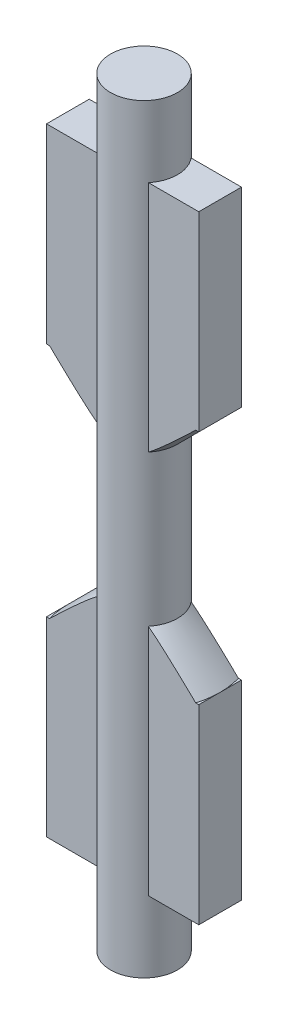
ISO-10303-21;
HEADER;
FILE_DESCRIPTION(('STEP AP214'),'2;1');
FILE_NAME('part.step','',(''),(''),'','','');
FILE_SCHEMA(('AUTOMOTIVE_DESIGN { 1 0 10303 214 1 1 1 1 }'));
ENDSEC;
DATA;
#1=APPLICATION_CONTEXT('core data for automotive mechanical design processes');
#2=APPLICATION_PROTOCOL_DEFINITION('international standard','automotive_design',2000,#1);
#3=PRODUCT_CONTEXT('',#1,'mechanical');
#4=PRODUCT('Part','Part','',(#3));
#5=PRODUCT_RELATED_PRODUCT_CATEGORY('part','',(#4));
#6=PRODUCT_DEFINITION_FORMATION('','',#4);
#7=PRODUCT_DEFINITION_CONTEXT('part definition',#1,'design');
#8=PRODUCT_DEFINITION('design','',#6,#7);
#9=PRODUCT_DEFINITION_SHAPE('','',#8);
#10=(LENGTH_UNIT() NAMED_UNIT(*) SI_UNIT(.MILLI.,.METRE.));
#11=(NAMED_UNIT(*) PLANE_ANGLE_UNIT() SI_UNIT($,.RADIAN.));
#12=(NAMED_UNIT(*) SI_UNIT($,.STERADIAN.) SOLID_ANGLE_UNIT());
#13=UNCERTAINTY_MEASURE_WITH_UNIT(LENGTH_MEASURE(1.E-05),#10,'distance_accuracy_value','');
#14=(GEOMETRIC_REPRESENTATION_CONTEXT(3) GLOBAL_UNCERTAINTY_ASSIGNED_CONTEXT((#13)) GLOBAL_UNIT_ASSIGNED_CONTEXT((#10,
#11,#12)) REPRESENTATION_CONTEXT('',''));
#15=CARTESIAN_POINT('',(0.,0.,0.));
#16=DIRECTION('',(0.,0.,1.));
#17=DIRECTION('',(1.,0.,0.));
#18=AXIS2_PLACEMENT_3D('',#15,#16,#17);
#19=CARTESIAN_POINT('',(0.,18.4,0.));
#20=DIRECTION('',(0.,1.,0.));
#21=DIRECTION('',(0.,0.,1.));
#22=AXIS2_PLACEMENT_3D('',#19,#20,#21);
#23=PLANE('',#22);
#24=DIRECTION('',(1.,0.,0.));
#25=VECTOR('',#24,1.);
#26=CARTESIAN_POINT('',(-1.80900525151255,18.4,1.5));
#27=LINE('',#26,#25);
#28=CARTESIAN_POINT('',(-5.35,18.4,1.5));
#29=VERTEX_POINT('',#28);
#30=CARTESIAN_POINT('',(-5.13541624408382,18.4,1.5));
#31=VERTEX_POINT('',#30);
#32=EDGE_CURVE('E439',#29,#31,#27,.T.);
#33=ORIENTED_EDGE('',*,*,#32,.T.);
#34=CARTESIAN_POINT('',(0.,18.4,0.));
#35=DIRECTION('',(0.,1.,0.));
#36=DIRECTION('',(0.,0.,1.));
#37=AXIS2_PLACEMENT_3D('',#34,#35,#36);
#38=CIRCLE('',#37,5.34999999999999);
#39=CARTESIAN_POINT('',(-5.35,18.4,0.));
#40=VERTEX_POINT('',#39);
#41=EDGE_CURVE('E76',#31,#40,#38,.F.);
#42=ORIENTED_EDGE('',*,*,#41,.T.);
#43=DIRECTION('',(0.,0.,1.));
#44=VECTOR('',#43,1.);
#45=CARTESIAN_POINT('',(-5.35,18.4,1.5));
#46=LINE('',#45,#44);
#47=EDGE_CURVE('E440',#40,#29,#46,.T.);
#48=ORIENTED_EDGE('',*,*,#47,.T.);
#49=EDGE_LOOP('',(#33,#42,#48));
#50=FACE_BOUND('',#49,.T.);
#51=ADVANCED_FACE('F47',(#50),#23,.T.);
#52=DIRECTION('',(-1.,0.,0.));
#53=VECTOR('',#52,1.);
#54=CARTESIAN_POINT('',(5.35,18.4,-1.5));
#55=LINE('',#54,#53);
#56=CARTESIAN_POINT('',(5.35,18.4,-1.5));
#57=VERTEX_POINT('',#56);
#58=CARTESIAN_POINT('',(5.13541624408382,18.4,-1.5));
#59=VERTEX_POINT('',#58);
#60=EDGE_CURVE('E452',#57,#59,#55,.T.);
#61=ORIENTED_EDGE('',*,*,#60,.T.);
#62=CARTESIAN_POINT('',(0.,18.4,0.));
#63=DIRECTION('',(0.,1.,0.));
#64=DIRECTION('',(0.,0.,1.));
#65=AXIS2_PLACEMENT_3D('',#62,#63,#64);
#66=CIRCLE('',#65,5.34999999999999);
#67=CARTESIAN_POINT('',(5.35,18.4,0.));
#68=VERTEX_POINT('',#67);
#69=EDGE_CURVE('E295',#59,#68,#66,.F.);
#70=ORIENTED_EDGE('',*,*,#69,.T.);
#71=DIRECTION('',(0.,0.,-1.));
#72=VECTOR('',#71,1.);
#73=CARTESIAN_POINT('',(5.35,18.4,1.5));
#74=LINE('',#73,#72);
#75=EDGE_CURVE('E524',#68,#57,#74,.T.);
#76=ORIENTED_EDGE('',*,*,#75,.T.);
#77=EDGE_LOOP('',(#61,#70,#76));
#78=FACE_BOUND('',#77,.T.);
#79=ADVANCED_FACE('F408',(#78),#23,.T.);
#80=CARTESIAN_POINT('',(0.,35.,0.));
#81=DIRECTION('',(0.,1.,0.));
#82=DIRECTION('',(0.,0.,1.));
#83=AXIS2_PLACEMENT_3D('',#80,#81,#82);
#84=PLANE('',#83);
#85=DIRECTION('',(-1.,0.,0.));
#86=VECTOR('',#85,1.);
#87=CARTESIAN_POINT('',(0.,35.,1.5));
#88=LINE('',#87,#86);
#89=CARTESIAN_POINT('',(5.35,35.,1.5));
#90=VERTEX_POINT('',#89);
#91=CARTESIAN_POINT('',(5.13541624408385,35.,1.5));
#92=VERTEX_POINT('',#91);
#93=EDGE_CURVE('E557',#90,#92,#88,.T.);
#94=ORIENTED_EDGE('',*,*,#93,.T.);
#95=CARTESIAN_POINT('',(0.,35.,0.));
#96=DIRECTION('',(0.,1.,0.));
#97=DIRECTION('',(0.,0.,1.));
#98=AXIS2_PLACEMENT_3D('',#95,#96,#97);
#99=CIRCLE('',#98,5.35000000000002);
#100=CARTESIAN_POINT('',(5.35,35.,0.));
#101=VERTEX_POINT('',#100);
#102=EDGE_CURVE('E288',#92,#101,#99,.T.);
#103=ORIENTED_EDGE('',*,*,#102,.T.);
#104=DIRECTION('',(0.,0.,1.));
#105=VECTOR('',#104,1.);
#106=CARTESIAN_POINT('',(5.35,35.,0.));
#107=LINE('',#106,#105);
#108=EDGE_CURVE('E565',#101,#90,#107,.T.);
#109=ORIENTED_EDGE('',*,*,#108,.T.);
#110=EDGE_LOOP('',(#94,#103,#109));
#111=FACE_BOUND('',#110,.T.);
#112=ADVANCED_FACE('F415',(#111),#84,.F.);
#113=DIRECTION('',(1.,0.,0.));
#114=VECTOR('',#113,1.);
#115=CARTESIAN_POINT('',(0.,35.,-1.5));
#116=LINE('',#115,#114);
#117=CARTESIAN_POINT('',(-5.35,35.,-1.5));
#118=VERTEX_POINT('',#117);
#119=CARTESIAN_POINT('',(-5.13541624408385,35.,-1.5));
#120=VERTEX_POINT('',#119);
#121=EDGE_CURVE('E569',#118,#120,#116,.T.);
#122=ORIENTED_EDGE('',*,*,#121,.T.);
#123=CARTESIAN_POINT('',(0.,35.,0.));
#124=DIRECTION('',(0.,1.,0.));
#125=DIRECTION('',(0.,0.,1.));
#126=AXIS2_PLACEMENT_3D('',#123,#124,#125);
#127=CIRCLE('',#126,5.35000000000002);
#128=CARTESIAN_POINT('',(-5.35,35.,0.));
#129=VERTEX_POINT('',#128);
#130=EDGE_CURVE('E251',#120,#129,#127,.T.);
#131=ORIENTED_EDGE('',*,*,#130,.T.);
#132=DIRECTION('',(0.,0.,-1.));
#133=VECTOR('',#132,1.);
#134=CARTESIAN_POINT('',(-5.35,35.,0.));
#135=LINE('',#134,#133);
#136=EDGE_CURVE('E240',#129,#118,#135,.T.);
#137=ORIENTED_EDGE('',*,*,#136,.T.);
#138=EDGE_LOOP('',(#122,#131,#137));
#139=FACE_BOUND('',#138,.T.);
#140=ADVANCED_FACE('F633',(#139),#84,.F.);
#141=CARTESIAN_POINT('',(0.,48.4,0.));
#142=DIRECTION('',(0.,1.,0.));
#143=DIRECTION('',(0.,0.,1.));
#144=AXIS2_PLACEMENT_3D('',#141,#142,#143);
#145=PLANE('',#144);
#146=CARTESIAN_POINT('',(0.,48.4,0.));
#147=DIRECTION('',(0.,1.,0.));
#148=DIRECTION('',(0.,0.,1.));
#149=AXIS2_PLACEMENT_3D('',#146,#147,#148);
#150=CIRCLE('',#149,2.35);
#151=CARTESIAN_POINT('',(1.80900525151255,48.4,1.5));
#152=VERTEX_POINT('',#151);
#153=CARTESIAN_POINT('',(1.80900525151255,48.4,-1.5));
#154=VERTEX_POINT('',#153);
#155=EDGE_CURVE('E223',#152,#154,#150,.T.);
#156=ORIENTED_EDGE('',*,*,#155,.F.);
#157=DIRECTION('',(-1.,0.,0.));
#158=VECTOR('',#157,1.);
#159=CARTESIAN_POINT('',(0.,48.4,1.5));
#160=LINE('',#159,#158);
#161=CARTESIAN_POINT('',(5.35,48.4,1.5));
#162=VERTEX_POINT('',#161);
#163=EDGE_CURVE('E203',#162,#152,#160,.T.);
#164=ORIENTED_EDGE('',*,*,#163,.F.);
#165=DIRECTION('',(0.,0.,1.));
#166=VECTOR('',#165,1.);
#167=CARTESIAN_POINT('',(5.35,48.4,0.));
#168=LINE('',#167,#166);
#169=CARTESIAN_POINT('',(5.35,48.4,-1.5));
#170=VERTEX_POINT('',#169);
#171=EDGE_CURVE('E217',#170,#162,#168,.T.);
#172=ORIENTED_EDGE('',*,*,#171,.F.);
#173=DIRECTION('',(1.,0.,0.));
#174=VECTOR('',#173,1.);
#175=CARTESIAN_POINT('',(0.,48.4,-1.5));
#176=LINE('',#175,#174);
#177=EDGE_CURVE('E233',#154,#170,#176,.T.);
#178=ORIENTED_EDGE('',*,*,#177,.F.);
#179=EDGE_LOOP('',(#156,#164,#172,#178));
#180=FACE_BOUND('',#179,.T.);
#181=ADVANCED_FACE('F231',(#180),#145,.T.);
#182=CARTESIAN_POINT('',(5.35,18.4,1.5));
#183=VERTEX_POINT('',#182);
#184=EDGE_CURVE('E457',#183,#68,#74,.T.);
#185=ORIENTED_EDGE('',*,*,#184,.T.);
#186=CARTESIAN_POINT('',(0.,18.4,0.));
#187=DIRECTION('',(0.,1.,0.));
#188=DIRECTION('',(0.,0.,1.));
#189=AXIS2_PLACEMENT_3D('',#186,#187,#188);
#190=CIRCLE('',#189,5.34999999999999);
#191=CARTESIAN_POINT('',(5.13541624408382,18.4,1.5));
#192=VERTEX_POINT('',#191);
#193=EDGE_CURVE('E292',#68,#192,#190,.F.);
#194=ORIENTED_EDGE('',*,*,#193,.T.);
#195=DIRECTION('',(1.,0.,0.));
#196=VECTOR('',#195,1.);
#197=CARTESIAN_POINT('',(1.80900525151255,18.4,1.5));
#198=LINE('',#197,#196);
#199=EDGE_CURVE('E484',#192,#183,#198,.T.);
#200=ORIENTED_EDGE('',*,*,#199,.T.);
#201=EDGE_LOOP('',(#185,#194,#200));
#202=FACE_BOUND('',#201,.T.);
#203=ADVANCED_FACE('F401',(#202),#23,.T.);
#204=CARTESIAN_POINT('',(0.,5.,0.));
#205=DIRECTION('',(0.,-1.,0.));
#206=DIRECTION('',(0.,0.,-1.));
#207=AXIS2_PLACEMENT_3D('',#204,#205,#206);
#208=CYLINDRICAL_SURFACE('',#207,2.35);
#209=DIRECTION('',(0.,-1.,0.));
#210=VECTOR('',#209,1.);
#211=CARTESIAN_POINT('',(-1.80900525151255,48.4,1.5));
#212=LINE('',#211,#210);
#213=CARTESIAN_POINT('',(-1.80900525151255,48.4,1.5));
#214=VERTEX_POINT('',#213);
#215=CARTESIAN_POINT('',(-1.80900525151255,32.,1.5));
#216=VERTEX_POINT('',#215);
#217=EDGE_CURVE('E228',#214,#216,#212,.T.);
#218=ORIENTED_EDGE('',*,*,#217,.T.);
#219=CARTESIAN_POINT('',(0.,32.,0.));
#220=DIRECTION('',(0.,1.,0.));
#221=DIRECTION('',(0.,0.,1.));
#222=AXIS2_PLACEMENT_3D('',#219,#220,#221);
#223=CIRCLE('',#222,2.35);
#224=CARTESIAN_POINT('',(-1.80900525151255,32.,-1.5));
#225=VERTEX_POINT('',#224);
#226=EDGE_CURVE('E281',#216,#225,#223,.F.);
#227=ORIENTED_EDGE('',*,*,#226,.T.);
#228=DIRECTION('',(0.,-1.,0.));
#229=VECTOR('',#228,1.);
#230=CARTESIAN_POINT('',(-1.80900525151255,48.4,-1.5));
#231=LINE('',#230,#229);
#232=CARTESIAN_POINT('',(-1.80900525151255,48.4,-1.5));
#233=VERTEX_POINT('',#232);
#234=EDGE_CURVE('E536',#233,#225,#231,.T.);
#235=ORIENTED_EDGE('',*,*,#234,.F.);
#236=EDGE_CURVE('E237',#233,#214,#150,.T.);
#237=ORIENTED_EDGE('',*,*,#236,.T.);
#238=EDGE_LOOP('',(#218,#227,#235,#237));
#239=FACE_BOUND('',#238,.T.);
#240=CARTESIAN_POINT('',(0.,21.4,0.));
#241=DIRECTION('',(0.,1.,0.));
#242=DIRECTION('',(0.,0.,1.));
#243=AXIS2_PLACEMENT_3D('',#240,#241,#242);
#244=CIRCLE('',#243,2.35);
#245=CARTESIAN_POINT('',(-1.80900525151255,21.4,-1.5));
#246=VERTEX_POINT('',#245);
#247=CARTESIAN_POINT('',(-1.80900525151255,21.4,1.5));
#248=VERTEX_POINT('',#247);
#249=EDGE_CURVE('E271',#246,#248,#244,.T.);
#250=ORIENTED_EDGE('',*,*,#249,.T.);
#251=DIRECTION('',(0.,-1.,0.));
#252=VECTOR('',#251,1.);
#253=CARTESIAN_POINT('',(-1.80900525151255,18.4,1.5));
#254=LINE('',#253,#252);
#255=CARTESIAN_POINT('',(-1.80900525151255,5.,1.5));
#256=VERTEX_POINT('',#255);
#257=EDGE_CURVE('E463',#248,#256,#254,.T.);
#258=ORIENTED_EDGE('',*,*,#257,.T.);
#259=CARTESIAN_POINT('',(0.,5.,0.));
#260=DIRECTION('',(0.,1.,0.));
#261=DIRECTION('',(0.,0.,1.));
#262=AXIS2_PLACEMENT_3D('',#259,#260,#261);
#263=CIRCLE('',#262,2.35);
#264=CARTESIAN_POINT('',(-1.80900525151255,5.,-1.5));
#265=VERTEX_POINT('',#264);
#266=EDGE_CURVE('E253',#265,#256,#263,.T.);
#267=ORIENTED_EDGE('',*,*,#266,.F.);
#268=DIRECTION('',(0.,-1.,0.));
#269=VECTOR('',#268,1.);
#270=CARTESIAN_POINT('',(-1.80900525151255,18.4,-1.5));
#271=LINE('',#270,#269);
#272=EDGE_CURVE('E448',#246,#265,#271,.T.);
#273=ORIENTED_EDGE('',*,*,#272,.F.);
#274=EDGE_LOOP('',(#250,#258,#267,#273));
#275=FACE_BOUND('',#274,.T.);
#276=CARTESIAN_POINT('',(0.,21.4,0.));
#277=DIRECTION('',(0.,1.,0.));
#278=DIRECTION('',(0.,0.,1.));
#279=AXIS2_PLACEMENT_3D('',#276,#277,#278);
#280=CIRCLE('',#279,2.35);
#281=CARTESIAN_POINT('',(1.80900525151255,21.4,1.5));
#282=VERTEX_POINT('',#281);
#283=CARTESIAN_POINT('',(1.80900525151255,21.4,-1.5));
#284=VERTEX_POINT('',#283);
#285=EDGE_CURVE('E275',#282,#284,#280,.T.);
#286=ORIENTED_EDGE('',*,*,#285,.T.);
#287=DIRECTION('',(0.,-1.,0.));
#288=VECTOR('',#287,1.);
#289=CARTESIAN_POINT('',(1.80900525151255,18.4,-1.5));
#290=LINE('',#289,#288);
#291=CARTESIAN_POINT('',(1.80900525151255,5.,-1.5));
#292=VERTEX_POINT('',#291);
#293=EDGE_CURVE('E496',#284,#292,#290,.T.);
#294=ORIENTED_EDGE('',*,*,#293,.T.);
#295=CARTESIAN_POINT('',(1.80900525151255,5.,1.5));
#296=VERTEX_POINT('',#295);
#297=EDGE_CURVE('E246',#296,#292,#263,.T.);
#298=ORIENTED_EDGE('',*,*,#297,.F.);
#299=DIRECTION('',(0.,-1.,0.));
#300=VECTOR('',#299,1.);
#301=CARTESIAN_POINT('',(1.80900525151255,18.4,1.5));
#302=LINE('',#301,#300);
#303=EDGE_CURVE('E263',#282,#296,#302,.T.);
#304=ORIENTED_EDGE('',*,*,#303,.F.);
#305=EDGE_LOOP('',(#286,#294,#298,#304));
#306=FACE_BOUND('',#305,.T.);
#307=CARTESIAN_POINT('',(0.,0.,0.));
#308=DIRECTION('',(0.,1.,0.));
#309=DIRECTION('',(0.,0.,1.));
#310=AXIS2_PLACEMENT_3D('',#307,#308,#309);
#311=CIRCLE('',#310,2.35);
#312=CARTESIAN_POINT('',(0.,0.,2.35));
#313=VERTEX_POINT('',#312);
#314=EDGE_CURVE('E260',#313,#313,#311,.T.);
#315=ORIENTED_EDGE('',*,*,#314,.T.);
#316=EDGE_LOOP('',(#315));
#317=FACE_BOUND('',#316,.T.);
#318=DIRECTION('',(0.,-1.,0.));
#319=VECTOR('',#318,1.);
#320=CARTESIAN_POINT('',(1.80900525151255,48.4,-1.5));
#321=LINE('',#320,#319);
#322=CARTESIAN_POINT('',(1.80900525151255,32.,-1.5));
#323=VERTEX_POINT('',#322);
#324=EDGE_CURVE('E539',#154,#323,#321,.T.);
#325=ORIENTED_EDGE('',*,*,#324,.T.);
#326=CARTESIAN_POINT('',(0.,32.,0.));
#327=DIRECTION('',(0.,1.,0.));
#328=DIRECTION('',(0.,0.,1.));
#329=AXIS2_PLACEMENT_3D('',#326,#327,#328);
#330=CIRCLE('',#329,2.35);
#331=CARTESIAN_POINT('',(1.80900525151255,32.,1.5));
#332=VERTEX_POINT('',#331);
#333=EDGE_CURVE('E225',#323,#332,#330,.F.);
#334=ORIENTED_EDGE('',*,*,#333,.T.);
#335=DIRECTION('',(0.,-1.,0.));
#336=VECTOR('',#335,1.);
#337=CARTESIAN_POINT('',(1.80900525151255,48.4,1.5));
#338=LINE('',#337,#336);
#339=EDGE_CURVE('E207',#152,#332,#338,.T.);
#340=ORIENTED_EDGE('',*,*,#339,.F.);
#341=ORIENTED_EDGE('',*,*,#155,.T.);
#342=EDGE_LOOP('',(#325,#334,#340,#341));
#343=FACE_BOUND('',#342,.T.);
#344=CARTESIAN_POINT('',(0.,53.4,0.));
#345=DIRECTION('',(0.,1.,0.));
#346=DIRECTION('',(0.,0.,1.));
#347=AXIS2_PLACEMENT_3D('',#344,#345,#346);
#348=CIRCLE('',#347,2.35);
#349=CARTESIAN_POINT('',(0.,53.4,2.35));
#350=VERTEX_POINT('',#349);
#351=EDGE_CURVE('E235',#350,#350,#348,.T.);
#352=ORIENTED_EDGE('',*,*,#351,.F.);
#353=EDGE_LOOP('',(#352));
#354=FACE_BOUND('',#353,.T.);
#355=ADVANCED_FACE('F221',(#239,#275,#306,#317,#343,#354),#208,.T.);
#356=CARTESIAN_POINT('',(0.,0.,0.));
#357=DIRECTION('',(0.,1.,0.));
#358=DIRECTION('',(0.,0.,1.));
#359=AXIS2_PLACEMENT_3D('',#356,#357,#358);
#360=PLANE('',#359);
#361=ORIENTED_EDGE('',*,*,#314,.F.);
#362=EDGE_LOOP('',(#361));
#363=FACE_BOUND('',#362,.T.);
#364=ADVANCED_FACE('F396',(#363),#360,.F.);
#365=CARTESIAN_POINT('',(0.,5.,0.));
#366=DIRECTION('',(0.,1.,0.));
#367=DIRECTION('',(0.,0.,1.));
#368=AXIS2_PLACEMENT_3D('',#365,#366,#367);
#369=PLANE('',#368);
#370=DIRECTION('',(1.,0.,0.));
#371=VECTOR('',#370,1.);
#372=CARTESIAN_POINT('',(1.80900525151255,5.,1.5));
#373=LINE('',#372,#371);
#374=CARTESIAN_POINT('',(5.35,5.,1.5));
#375=VERTEX_POINT('',#374);
#376=EDGE_CURVE('E464',#296,#375,#373,.T.);
#377=ORIENTED_EDGE('',*,*,#376,.F.);
#378=ORIENTED_EDGE('',*,*,#297,.T.);
#379=DIRECTION('',(-1.,0.,0.));
#380=VECTOR('',#379,1.);
#381=CARTESIAN_POINT('',(5.35,5.,-1.5));
#382=LINE('',#381,#380);
#383=CARTESIAN_POINT('',(5.35,5.,-1.5));
#384=VERTEX_POINT('',#383);
#385=EDGE_CURVE('E471',#384,#292,#382,.T.);
#386=ORIENTED_EDGE('',*,*,#385,.F.);
#387=DIRECTION('',(0.,0.,-1.));
#388=VECTOR('',#387,1.);
#389=CARTESIAN_POINT('',(5.35,5.,1.5));
#390=LINE('',#389,#388);
#391=EDGE_CURVE('E467',#375,#384,#390,.T.);
#392=ORIENTED_EDGE('',*,*,#391,.F.);
#393=EDGE_LOOP('',(#377,#378,#386,#392));
#394=FACE_BOUND('',#393,.T.);
#395=ADVANCED_FACE('F398',(#394),#369,.F.);
#396=DIRECTION('',(-1.,0.,0.));
#397=VECTOR('',#396,1.);
#398=CARTESIAN_POINT('',(-5.35,5.,-1.5));
#399=LINE('',#398,#397);
#400=CARTESIAN_POINT('',(-5.35,5.,-1.5));
#401=VERTEX_POINT('',#400);
#402=EDGE_CURVE('E474',#265,#401,#399,.T.);
#403=ORIENTED_EDGE('',*,*,#402,.F.);
#404=ORIENTED_EDGE('',*,*,#266,.T.);
#405=DIRECTION('',(1.,0.,0.));
#406=VECTOR('',#405,1.);
#407=CARTESIAN_POINT('',(-1.80900525151255,5.,1.5));
#408=LINE('',#407,#406);
#409=CARTESIAN_POINT('',(-5.35,5.,1.5));
#410=VERTEX_POINT('',#409);
#411=EDGE_CURVE('E480',#410,#256,#408,.T.);
#412=ORIENTED_EDGE('',*,*,#411,.F.);
#413=DIRECTION('',(0.,0.,1.));
#414=VECTOR('',#413,1.);
#415=CARTESIAN_POINT('',(-5.35,5.,1.5));
#416=LINE('',#415,#414);
#417=EDGE_CURVE('E477',#401,#410,#416,.T.);
#418=ORIENTED_EDGE('',*,*,#417,.F.);
#419=EDGE_LOOP('',(#403,#404,#412,#418));
#420=FACE_BOUND('',#419,.T.);
#421=ADVANCED_FACE('F394',(#420),#369,.F.);
#422=CARTESIAN_POINT('',(1.80900525151255,18.4,1.5));
#423=DIRECTION('',(0.,0.,-1.));
#424=DIRECTION('',(-1.,0.,0.));
#425=AXIS2_PLACEMENT_3D('',#422,#423,#424);
#426=PLANE('',#425);
#427=ORIENTED_EDGE('',*,*,#376,.T.);
#428=DIRECTION('',(0.,-1.,0.));
#429=VECTOR('',#428,1.);
#430=CARTESIAN_POINT('',(5.35,18.4,1.5));
#431=LINE('',#430,#429);
#432=EDGE_CURVE('E503',#183,#375,#431,.T.);
#433=ORIENTED_EDGE('',*,*,#432,.F.);
#434=ORIENTED_EDGE('',*,*,#199,.F.);
#435=CARTESIAN_POINT('',(5.13541624408382,18.4,1.5));
#436=CARTESIAN_POINT('',(5.00071843946686,18.529280766389,1.5));
#437=CARTESIAN_POINT('',(4.86583401406331,18.6583682606425,1.5));
#438=CARTESIAN_POINT('',(4.59555739072456,18.9160119947905,1.5));
#439=CARTESIAN_POINT('',(4.46016518978536,19.0445682315324,1.5));
#440=CARTESIAN_POINT('',(4.18881142526178,19.300935797662,1.5));
#441=CARTESIAN_POINT('',(4.05285019842756,19.428747483136,1.5));
#442=CARTESIAN_POINT('',(3.78008007891827,19.683475890813,1.5));
#443=CARTESIAN_POINT('',(3.64327115111968,19.8103925754606,1.5));
#444=CARTESIAN_POINT('',(3.36843946566051,20.0630691685538,1.5));
#445=CARTESIAN_POINT('',(3.23041604217317,20.1888283536838,1.5));
#446=CARTESIAN_POINT('',(2.95281173159275,20.4385952972125,1.5));
#447=CARTESIAN_POINT('',(2.81323100545014,20.5626032336592,1.5));
#448=CARTESIAN_POINT('',(2.60211424091341,20.7466978210054,1.5));
#449=CARTESIAN_POINT('',(2.53143007558843,20.8077607391812,1.5));
#450=CARTESIAN_POINT('',(2.38936229644239,20.9290632642139,1.5));
#451=CARTESIAN_POINT('',(2.31797870784265,20.9893029005724,1.5));
#452=CARTESIAN_POINT('',(2.17432594452256,21.1087714168354,1.5));
#453=CARTESIAN_POINT('',(2.1020564752589,21.1679999439876,1.5));
#454=CARTESIAN_POINT('',(1.95641434860567,21.2851014607559,1.5));
#455=CARTESIAN_POINT('',(1.88304155521169,21.3429742809703,1.5));
#456=CARTESIAN_POINT('',(1.80900525151255,21.4,1.5));
#457=B_SPLINE_CURVE_WITH_KNOTS('',3,(#435,#436,#437,#438,#439,#440,#441,#442,#443,#444,#445,
#446,#447,#448,#449,#450,#451,#452,#453,#454,#455,#456),.UNSPECIFIED.,.F.,.F.,(4,2,2,2,2,2,2,2,
2,2,4),(0.,0.560102037349026,1.12020739350906,1.68001828719653,2.23985253321365,
2.80001564047742,3.36012138036075,3.64033849074675,3.92054553337738,4.2008484142389,
4.48118613538617),.UNSPECIFIED.);
#458=EDGE_CURVE('E375',#192,#282,#457,.T.);
#459=ORIENTED_EDGE('',*,*,#458,.T.);
#460=ORIENTED_EDGE('',*,*,#303,.T.);
#461=EDGE_LOOP('',(#427,#433,#434,#459,#460));
#462=FACE_BOUND('',#461,.T.);
#463=ADVANCED_FACE('F388',(#462),#426,.F.);
#464=CARTESIAN_POINT('',(5.35,18.4,1.5));
#465=DIRECTION('',(-1.,0.,0.));
#466=DIRECTION('',(0.,0.,1.));
#467=AXIS2_PLACEMENT_3D('',#464,#465,#466);
#468=PLANE('',#467);
#469=ORIENTED_EDGE('',*,*,#391,.T.);
#470=DIRECTION('',(0.,-1.,0.));
#471=VECTOR('',#470,1.);
#472=CARTESIAN_POINT('',(5.35,18.4,-1.5));
#473=LINE('',#472,#471);
#474=EDGE_CURVE('E500',#57,#384,#473,.T.);
#475=ORIENTED_EDGE('',*,*,#474,.F.);
#476=ORIENTED_EDGE('',*,*,#75,.F.);
#477=ORIENTED_EDGE('',*,*,#184,.F.);
#478=ORIENTED_EDGE('',*,*,#432,.T.);
#479=EDGE_LOOP('',(#469,#475,#476,#477,#478));
#480=FACE_BOUND('',#479,.T.);
#481=ADVANCED_FACE('F393',(#480),#468,.F.);
#482=CARTESIAN_POINT('',(5.35,18.4,-1.5));
#483=DIRECTION('',(0.,0.,1.));
#484=DIRECTION('',(1.,0.,0.));
#485=AXIS2_PLACEMENT_3D('',#482,#483,#484);
#486=PLANE('',#485);
#487=ORIENTED_EDGE('',*,*,#385,.T.);
#488=ORIENTED_EDGE('',*,*,#293,.F.);
#489=CARTESIAN_POINT('',(1.80900525151255,21.4,-1.5));
#490=CARTESIAN_POINT('',(1.85459308370229,21.3649023054609,-1.5));
#491=CARTESIAN_POINT('',(1.89992292185459,21.3294725364219,-1.5));
#492=CARTESIAN_POINT('',(1.99012847959698,21.2580433764716,-1.5));
#493=CARTESIAN_POINT('',(2.03500421992746,21.2220440117702,-1.5));
#494=CARTESIAN_POINT('',(2.16903355285177,21.1133412104967,-1.5));
#495=CARTESIAN_POINT('',(2.25760530317743,21.0399206128479,-1.5));
#496=CARTESIAN_POINT('',(2.4335281827543,20.8917103819181,-1.5));
#497=CARTESIAN_POINT('',(2.52087980023982,20.8169213256071,-1.5));
#498=CARTESIAN_POINT('',(2.69466482323332,20.6662767234103,-1.5));
#499=CARTESIAN_POINT('',(2.78109818106429,20.5904211226189,-1.5));
#500=CARTESIAN_POINT('',(3.03920923956875,20.3617287227132,-1.5));
#501=CARTESIAN_POINT('',(3.20980645423627,20.2076737688511,-1.5));
#502=CARTESIAN_POINT('',(3.54914315621954,19.8975037283989,-1.5));
#503=CARTESIAN_POINT('',(3.71788243226037,19.7413884118639,-1.5));
#504=CARTESIAN_POINT('',(3.99086761162389,19.4867137022444,-1.5));
#505=CARTESIAN_POINT('',(4.09551149639255,19.3885802539876,-1.5));
#506=CARTESIAN_POINT('',(4.30438143497063,19.191879328637,-1.5));
#507=CARTESIAN_POINT('',(4.40860750756997,19.0933118714894,-1.5));
#508=CARTESIAN_POINT('',(4.61675551239115,18.8957902928172,-1.5));
#509=CARTESIAN_POINT('',(4.72067733714815,18.7968360581187,-1.5));
#510=CARTESIAN_POINT('',(4.92824282152978,18.5986273256378,-1.5));
#511=CARTESIAN_POINT('',(5.03188646903372,18.4993728151603,-1.5));
#512=CARTESIAN_POINT('',(5.13541624408382,18.4,-1.5));
#513=B_SPLINE_CURVE_WITH_KNOTS('',3,(#489,#490,#491,#492,#493,#494,#495,#496,#497,#498,#499,
#500,#501,#502,#503,#504,#505,#506,#507,#508,#509,#510,#511,#512),.UNSPECIFIED.,.F.,.F.,(4,2,2,
2,2,2,2,2,2,2,2,4),(0.,0.172596031266814,0.345184143506358,0.690299447420004,1.03527245167358,
1.38026328060508,2.06981710981823,2.75944855800837,3.18982453543085,3.62018093577322,
4.05067443158925,4.48118638979429),.UNSPECIFIED.);
#514=EDGE_CURVE('E347',#284,#59,#513,.T.);
#515=ORIENTED_EDGE('',*,*,#514,.T.);
#516=ORIENTED_EDGE('',*,*,#60,.F.);
#517=ORIENTED_EDGE('',*,*,#474,.T.);
#518=EDGE_LOOP('',(#487,#488,#515,#516,#517));
#519=FACE_BOUND('',#518,.T.);
#520=ADVANCED_FACE('F521',(#519),#486,.F.);
#521=CARTESIAN_POINT('',(-5.35,18.4,-1.5));
#522=DIRECTION('',(0.,0.,1.));
#523=DIRECTION('',(1.,0.,0.));
#524=AXIS2_PLACEMENT_3D('',#521,#522,#523);
#525=PLANE('',#524);
#526=ORIENTED_EDGE('',*,*,#402,.T.);
#527=DIRECTION('',(0.,-1.,0.));
#528=VECTOR('',#527,1.);
#529=CARTESIAN_POINT('',(-5.35,18.4,-1.5));
#530=LINE('',#529,#528);
#531=CARTESIAN_POINT('',(-5.35,18.4,-1.5));
#532=VERTEX_POINT('',#531);
#533=EDGE_CURVE('E450',#532,#401,#530,.T.);
#534=ORIENTED_EDGE('',*,*,#533,.F.);
#535=DIRECTION('',(-1.,0.,0.));
#536=VECTOR('',#535,1.);
#537=CARTESIAN_POINT('',(-5.35,18.4,-1.5));
#538=LINE('',#537,#536);
#539=CARTESIAN_POINT('',(-5.13541624408382,18.4,-1.5));
#540=VERTEX_POINT('',#539);
#541=EDGE_CURVE('E434',#540,#532,#538,.T.);
#542=ORIENTED_EDGE('',*,*,#541,.F.);
#543=CARTESIAN_POINT('',(-5.13541624408382,18.4,-1.5));
#544=CARTESIAN_POINT('',(-5.00071843946686,18.529280766389,-1.5));
#545=CARTESIAN_POINT('',(-4.86583401406331,18.6583682606425,-1.5));
#546=CARTESIAN_POINT('',(-4.59555739072456,18.9160119947905,-1.5));
#547=CARTESIAN_POINT('',(-4.46016518978536,19.0445682315324,-1.5));
#548=CARTESIAN_POINT('',(-4.18881142526178,19.300935797662,-1.5));
#549=CARTESIAN_POINT('',(-4.05285019842756,19.428747483136,-1.5));
#550=CARTESIAN_POINT('',(-3.78008007891827,19.683475890813,-1.5));
#551=CARTESIAN_POINT('',(-3.64327115111968,19.8103925754606,-1.5));
#552=CARTESIAN_POINT('',(-3.36843946566051,20.0630691685538,-1.5));
#553=CARTESIAN_POINT('',(-3.23041604217317,20.1888283536838,-1.5));
#554=CARTESIAN_POINT('',(-2.95281173159275,20.4385952972125,-1.5));
#555=CARTESIAN_POINT('',(-2.81323100545014,20.5626032336592,-1.5));
#556=CARTESIAN_POINT('',(-2.60211424091341,20.7466978210054,-1.5));
#557=CARTESIAN_POINT('',(-2.53143007558843,20.8077607391812,-1.5));
#558=CARTESIAN_POINT('',(-2.38936229644239,20.9290632642139,-1.5));
#559=CARTESIAN_POINT('',(-2.31797870784265,20.9893029005724,-1.5));
#560=CARTESIAN_POINT('',(-2.17432594452256,21.1087714168354,-1.5));
#561=CARTESIAN_POINT('',(-2.1020564752589,21.1679999439876,-1.5));
#562=CARTESIAN_POINT('',(-1.95641434860567,21.2851014607559,-1.5));
#563=CARTESIAN_POINT('',(-1.88304155521168,21.3429742809703,-1.5));
#564=CARTESIAN_POINT('',(-1.80900525151255,21.4,-1.5));
#565=B_SPLINE_CURVE_WITH_KNOTS('',3,(#543,#544,#545,#546,#547,#548,#549,#550,#551,#552,#553,
#554,#555,#556,#557,#558,#559,#560,#561,#562,#563,#564),.UNSPECIFIED.,.F.,.F.,(4,2,2,2,2,2,2,2,
2,2,4),(0.,0.560102037349023,1.12020739350906,1.68001828719653,2.23985253321365,
2.80001564047743,3.36012138036075,3.64033849074675,3.92054553337738,4.2008484142389,
4.48118613538617),.UNSPECIFIED.);
#566=EDGE_CURVE('E11',#540,#246,#565,.T.);
#567=ORIENTED_EDGE('',*,*,#566,.T.);
#568=ORIENTED_EDGE('',*,*,#272,.T.);
#569=EDGE_LOOP('',(#526,#534,#542,#567,#568));
#570=FACE_BOUND('',#569,.T.);
#571=ADVANCED_FACE('F447',(#570),#525,.F.);
#572=CARTESIAN_POINT('',(-5.35,18.4,1.5));
#573=DIRECTION('',(1.,0.,0.));
#574=DIRECTION('',(0.,0.,-1.));
#575=AXIS2_PLACEMENT_3D('',#572,#573,#574);
#576=PLANE('',#575);
#577=ORIENTED_EDGE('',*,*,#417,.T.);
#578=DIRECTION('',(0.,-1.,0.));
#579=VECTOR('',#578,1.);
#580=CARTESIAN_POINT('',(-5.35,18.4,1.5));
#581=LINE('',#580,#579);
#582=EDGE_CURVE('E488',#29,#410,#581,.T.);
#583=ORIENTED_EDGE('',*,*,#582,.F.);
#584=ORIENTED_EDGE('',*,*,#47,.F.);
#585=EDGE_CURVE('E431',#532,#40,#46,.T.);
#586=ORIENTED_EDGE('',*,*,#585,.F.);
#587=ORIENTED_EDGE('',*,*,#533,.T.);
#588=EDGE_LOOP('',(#577,#583,#584,#586,#587));
#589=FACE_BOUND('',#588,.T.);
#590=ADVANCED_FACE('F428',(#589),#576,.F.);
#591=CARTESIAN_POINT('',(-1.80900525151255,18.4,1.5));
#592=DIRECTION('',(0.,0.,-1.));
#593=DIRECTION('',(-1.,0.,0.));
#594=AXIS2_PLACEMENT_3D('',#591,#592,#593);
#595=PLANE('',#594);
#596=ORIENTED_EDGE('',*,*,#411,.T.);
#597=ORIENTED_EDGE('',*,*,#257,.F.);
#598=CARTESIAN_POINT('',(-1.80900525151255,21.4,1.5));
#599=CARTESIAN_POINT('',(-1.85459308370229,21.3649023054609,1.5));
#600=CARTESIAN_POINT('',(-1.89992292185459,21.3294725364219,1.5));
#601=CARTESIAN_POINT('',(-1.99012847959698,21.2580433764716,1.5));
#602=CARTESIAN_POINT('',(-2.03500421992746,21.2220440117702,1.5));
#603=CARTESIAN_POINT('',(-2.16903355285177,21.1133412104967,1.5));
#604=CARTESIAN_POINT('',(-2.25760530317743,21.0399206128479,1.5));
#605=CARTESIAN_POINT('',(-2.4335281827543,20.8917103819181,1.5));
#606=CARTESIAN_POINT('',(-2.52087980023982,20.8169213256071,1.5));
#607=CARTESIAN_POINT('',(-2.69466482323331,20.6662767234103,1.5));
#608=CARTESIAN_POINT('',(-2.78109818106428,20.5904211226189,1.5));
#609=CARTESIAN_POINT('',(-3.03920923956875,20.3617287227132,1.5));
#610=CARTESIAN_POINT('',(-3.20980645423627,20.2076737688511,1.5));
#611=CARTESIAN_POINT('',(-3.54914315621954,19.8975037283989,1.5));
#612=CARTESIAN_POINT('',(-3.71788243226037,19.7413884118639,1.5));
#613=CARTESIAN_POINT('',(-3.99086761162389,19.4867137022444,1.5));
#614=CARTESIAN_POINT('',(-4.09551149639255,19.3885802539876,1.5));
#615=CARTESIAN_POINT('',(-4.30438143497063,19.191879328637,1.5));
#616=CARTESIAN_POINT('',(-4.40860750756997,19.0933118714894,1.5));
#617=CARTESIAN_POINT('',(-4.61675551239115,18.8957902928172,1.5));
#618=CARTESIAN_POINT('',(-4.72067733714815,18.7968360581187,1.5));
#619=CARTESIAN_POINT('',(-4.92824282152978,18.5986273256378,1.5));
#620=CARTESIAN_POINT('',(-5.03188646903372,18.4993728151603,1.5));
#621=CARTESIAN_POINT('',(-5.13541624408382,18.4,1.5));
#622=B_SPLINE_CURVE_WITH_KNOTS('',3,(#598,#599,#600,#601,#602,#603,#604,#605,#606,#607,#608,
#609,#610,#611,#612,#613,#614,#615,#616,#617,#618,#619,#620,#621),.UNSPECIFIED.,.F.,.F.,(4,2,2,
2,2,2,2,2,2,2,2,4),(0.,0.172596031266814,0.345184143506359,0.690299447420004,1.03527245167357,
1.38026328060508,2.06981710981823,2.75944855800837,3.18982453543085,3.62018093577322,
4.05067443158925,4.48118638979429),.UNSPECIFIED.);
#623=EDGE_CURVE('E63',#248,#31,#622,.T.);
#624=ORIENTED_EDGE('',*,*,#623,.T.);
#625=ORIENTED_EDGE('',*,*,#32,.F.);
#626=ORIENTED_EDGE('',*,*,#582,.T.);
#627=EDGE_LOOP('',(#596,#597,#624,#625,#626));
#628=FACE_BOUND('',#627,.T.);
#629=ADVANCED_FACE('F420',(#628),#595,.F.);
#630=ORIENTED_EDGE('',*,*,#585,.T.);
#631=CARTESIAN_POINT('',(0.,18.4,0.));
#632=DIRECTION('',(0.,1.,0.));
#633=DIRECTION('',(0.,0.,1.));
#634=AXIS2_PLACEMENT_3D('',#631,#632,#633);
#635=CIRCLE('',#634,5.34999999999999);
#636=EDGE_CURVE('E298',#40,#540,#635,.F.);
#637=ORIENTED_EDGE('',*,*,#636,.T.);
#638=ORIENTED_EDGE('',*,*,#541,.T.);
#639=EDGE_LOOP('',(#630,#637,#638));
#640=FACE_BOUND('',#639,.T.);
#641=ADVANCED_FACE('F407',(#640),#23,.T.);
#642=CARTESIAN_POINT('',(5.35,35.,-1.5));
#643=VERTEX_POINT('',#642);
#644=EDGE_CURVE('E561',#643,#101,#107,.T.);
#645=ORIENTED_EDGE('',*,*,#644,.T.);
#646=CARTESIAN_POINT('',(0.,35.,0.));
#647=DIRECTION('',(0.,1.,0.));
#648=DIRECTION('',(0.,0.,1.));
#649=AXIS2_PLACEMENT_3D('',#646,#647,#648);
#650=CIRCLE('',#649,5.35000000000002);
#651=CARTESIAN_POINT('',(5.13541624408385,35.,-1.5));
#652=VERTEX_POINT('',#651);
#653=EDGE_CURVE('E285',#101,#652,#650,.T.);
#654=ORIENTED_EDGE('',*,*,#653,.T.);
#655=DIRECTION('',(1.,0.,0.));
#656=VECTOR('',#655,1.);
#657=CARTESIAN_POINT('',(0.,35.,-1.5));
#658=LINE('',#657,#656);
#659=EDGE_CURVE('E566',#652,#643,#658,.T.);
#660=ORIENTED_EDGE('',*,*,#659,.T.);
#661=EDGE_LOOP('',(#645,#654,#660));
#662=FACE_BOUND('',#661,.T.);
#663=ADVANCED_FACE('F332',(#662),#84,.F.);
#664=CARTESIAN_POINT('',(-5.35,35.,1.5));
#665=VERTEX_POINT('',#664);
#666=EDGE_CURVE('E573',#665,#129,#135,.T.);
#667=ORIENTED_EDGE('',*,*,#666,.T.);
#668=CARTESIAN_POINT('',(0.,35.,0.));
#669=DIRECTION('',(0.,1.,0.));
#670=DIRECTION('',(0.,0.,1.));
#671=AXIS2_PLACEMENT_3D('',#668,#669,#670);
#672=CIRCLE('',#671,5.35000000000002);
#673=CARTESIAN_POINT('',(-5.13541624408385,35.,1.5));
#674=VERTEX_POINT('',#673);
#675=EDGE_CURVE('E245',#129,#674,#672,.T.);
#676=ORIENTED_EDGE('',*,*,#675,.T.);
#677=DIRECTION('',(-1.,0.,0.));
#678=VECTOR('',#677,1.);
#679=CARTESIAN_POINT('',(0.,35.,1.5));
#680=LINE('',#679,#678);
#681=EDGE_CURVE('E553',#674,#665,#680,.T.);
#682=ORIENTED_EDGE('',*,*,#681,.T.);
#683=EDGE_LOOP('',(#667,#676,#682));
#684=FACE_BOUND('',#683,.T.);
#685=ADVANCED_FACE('F426',(#684),#84,.F.);
#686=CARTESIAN_POINT('',(-5.35,48.4,0.));
#687=DIRECTION('',(-1.,0.,0.));
#688=DIRECTION('',(0.,0.,1.));
#689=AXIS2_PLACEMENT_3D('',#686,#687,#688);
#690=PLANE('',#689);
#691=ORIENTED_EDGE('',*,*,#666,.F.);
#692=DIRECTION('',(0.,-1.,0.));
#693=VECTOR('',#692,1.);
#694=CARTESIAN_POINT('',(-5.35,48.4,1.5));
#695=LINE('',#694,#693);
#696=CARTESIAN_POINT('',(-5.35,48.4,1.5));
#697=VERTEX_POINT('',#696);
#698=EDGE_CURVE('E468',#697,#665,#695,.T.);
#699=ORIENTED_EDGE('',*,*,#698,.F.);
#700=DIRECTION('',(0.,0.,-1.));
#701=VECTOR('',#700,1.);
#702=CARTESIAN_POINT('',(-5.35,48.4,0.));
#703=LINE('',#702,#701);
#704=CARTESIAN_POINT('',(-5.35,48.4,-1.5));
#705=VERTEX_POINT('',#704);
#706=EDGE_CURVE('E556',#697,#705,#703,.T.);
#707=ORIENTED_EDGE('',*,*,#706,.T.);
#708=DIRECTION('',(0.,-1.,0.));
#709=VECTOR('',#708,1.);
#710=CARTESIAN_POINT('',(-5.35,48.4,-1.5));
#711=LINE('',#710,#709);
#712=EDGE_CURVE('E531',#705,#118,#711,.T.);
#713=ORIENTED_EDGE('',*,*,#712,.T.);
#714=ORIENTED_EDGE('',*,*,#136,.F.);
#715=EDGE_LOOP('',(#691,#699,#707,#713,#714));
#716=FACE_BOUND('',#715,.T.);
#717=ADVANCED_FACE('F330',(#716),#690,.T.);
#718=CARTESIAN_POINT('',(0.,48.4,1.5));
#719=DIRECTION('',(0.,0.,1.));
#720=DIRECTION('',(1.,0.,0.));
#721=AXIS2_PLACEMENT_3D('',#718,#719,#720);
#722=PLANE('',#721);
#723=ORIENTED_EDGE('',*,*,#681,.F.);
#724=CARTESIAN_POINT('',(-5.13541624408385,35.,1.5));
#725=CARTESIAN_POINT('',(-5.00071843946689,34.870719233611,1.5));
#726=CARTESIAN_POINT('',(-4.86583401406334,34.7416317393575,1.5));
#727=CARTESIAN_POINT('',(-4.59555739072459,34.4839880052095,1.5));
#728=CARTESIAN_POINT('',(-4.46016518978538,34.3554317684676,1.5));
#729=CARTESIAN_POINT('',(-4.18881142526179,34.099064202338,1.5));
#730=CARTESIAN_POINT('',(-4.05285019842758,33.9712525168641,1.5));
#731=CARTESIAN_POINT('',(-3.78008007891829,33.716524109187,1.5));
#732=CARTESIAN_POINT('',(-3.64327115111969,33.5896074245394,1.5));
#733=CARTESIAN_POINT('',(-3.36843946566052,33.3369308314462,1.5));
#734=CARTESIAN_POINT('',(-3.23041604217318,33.2111716463162,1.5));
#735=CARTESIAN_POINT('',(-2.95281173159277,32.9614047027875,1.5));
#736=CARTESIAN_POINT('',(-2.81323100545015,32.8373967663408,1.5));
#737=CARTESIAN_POINT('',(-2.60211424091342,32.6533021789946,1.5));
#738=CARTESIAN_POINT('',(-2.53143007558843,32.5922392608189,1.5));
#739=CARTESIAN_POINT('',(-2.38936229644239,32.4709367357861,1.5));
#740=CARTESIAN_POINT('',(-2.31797870784265,32.4106970994276,1.5));
#741=CARTESIAN_POINT('',(-2.17432594452256,32.2912285831646,1.5));
#742=CARTESIAN_POINT('',(-2.1020564752589,32.2320000560124,1.5));
#743=CARTESIAN_POINT('',(-1.95641434860567,32.1148985392441,1.5));
#744=CARTESIAN_POINT('',(-1.88304155521169,32.0570257190298,1.5));
#745=CARTESIAN_POINT('',(-1.80900525151255,32.,1.5));
#746=B_SPLINE_CURVE_WITH_KNOTS('',3,(#724,#725,#726,#727,#728,#729,#730,#731,#732,#733,#734,
#735,#736,#737,#738,#739,#740,#741,#742,#743,#744,#745),.UNSPECIFIED.,.F.,.F.,(4,2,2,2,2,2,2,2,
2,2,4),(0.,0.560102037349026,1.12020739350906,1.68001828719653,2.23985253321364,
2.80001564047742,3.36012138036074,3.64033849074675,3.92054553337737,4.20084841423889,
4.48118613538616),.UNSPECIFIED.);
#747=EDGE_CURVE('E303',#674,#216,#746,.T.);
#748=ORIENTED_EDGE('',*,*,#747,.T.);
#749=ORIENTED_EDGE('',*,*,#217,.F.);
#750=DIRECTION('',(-1.,0.,0.));
#751=VECTOR('',#750,1.);
#752=CARTESIAN_POINT('',(0.,48.4,1.5));
#753=LINE('',#752,#751);
#754=EDGE_CURVE('E216',#214,#697,#753,.T.);
#755=ORIENTED_EDGE('',*,*,#754,.T.);
#756=ORIENTED_EDGE('',*,*,#698,.T.);
#757=EDGE_LOOP('',(#723,#748,#749,#755,#756));
#758=FACE_BOUND('',#757,.T.);
#759=ADVANCED_FACE('F325',(#758),#722,.T.);
#760=CARTESIAN_POINT('',(0.,48.4,1.5));
#761=DIRECTION('',(0.,0.,1.));
#762=DIRECTION('',(1.,0.,0.));
#763=AXIS2_PLACEMENT_3D('',#760,#761,#762);
#764=PLANE('',#763);
#765=ORIENTED_EDGE('',*,*,#93,.F.);
#766=DIRECTION('',(0.,-1.,0.));
#767=VECTOR('',#766,1.);
#768=CARTESIAN_POINT('',(5.35,48.4,1.5));
#769=LINE('',#768,#767);
#770=EDGE_CURVE('E210',#162,#90,#769,.T.);
#771=ORIENTED_EDGE('',*,*,#770,.F.);
#772=ORIENTED_EDGE('',*,*,#163,.T.);
#773=ORIENTED_EDGE('',*,*,#339,.T.);
#774=CARTESIAN_POINT('',(1.80900525151255,32.,1.5));
#775=CARTESIAN_POINT('',(1.8545930837023,32.0350976945392,1.5));
#776=CARTESIAN_POINT('',(1.89992292185459,32.0705274635781,1.5));
#777=CARTESIAN_POINT('',(1.99012847959698,32.1419566235284,1.5));
#778=CARTESIAN_POINT('',(2.03500421992746,32.1779559882298,1.5));
#779=CARTESIAN_POINT('',(2.16903355285177,32.2866587895033,1.5));
#780=CARTESIAN_POINT('',(2.25760530317743,32.3600793871521,1.5));
#781=CARTESIAN_POINT('',(2.4335281827543,32.5082896180819,1.5));
#782=CARTESIAN_POINT('',(2.52087980023982,32.583078674393,1.5));
#783=CARTESIAN_POINT('',(2.69466482323332,32.7337232765897,1.5));
#784=CARTESIAN_POINT('',(2.78109818106429,32.8095788773811,1.5));
#785=CARTESIAN_POINT('',(3.03920923956875,33.0382712772868,1.5));
#786=CARTESIAN_POINT('',(3.20980645423628,33.1923262311489,1.5));
#787=CARTESIAN_POINT('',(3.54914315621954,33.5024962716011,1.5));
#788=CARTESIAN_POINT('',(3.71788243226038,33.6586115881361,1.5));
#789=CARTESIAN_POINT('',(3.9908676116239,33.9132862977556,1.5));
#790=CARTESIAN_POINT('',(4.09551149639256,34.0114197460124,1.5));
#791=CARTESIAN_POINT('',(4.30438143497065,34.208120671363,1.5));
#792=CARTESIAN_POINT('',(4.40860750756999,34.3066881285106,1.5));
#793=CARTESIAN_POINT('',(4.61675551239117,34.5042097071828,1.5));
#794=CARTESIAN_POINT('',(4.72067733714817,34.6031639418813,1.5));
#795=CARTESIAN_POINT('',(4.92824282152981,34.8013726743622,1.5));
#796=CARTESIAN_POINT('',(5.03188646903375,34.9006271848397,1.5));
#797=CARTESIAN_POINT('',(5.13541624408385,35.,1.5));
#798=B_SPLINE_CURVE_WITH_KNOTS('',3,(#774,#775,#776,#777,#778,#779,#780,#781,#782,#783,#784,
#785,#786,#787,#788,#789,#790,#791,#792,#793,#794,#795,#796,#797),.UNSPECIFIED.,.F.,.F.,(4,2,2,
2,2,2,2,2,2,2,2,4),(0.,0.172596031266815,0.345184143506361,0.69029944742,1.03527245167357,
1.38026328060507,2.06981710981821,2.75944855800836,3.18982453543083,3.62018093577321,
4.05067443158925,4.48118638979429),.UNSPECIFIED.);
#799=EDGE_CURVE('E340',#332,#92,#798,.T.);
#800=ORIENTED_EDGE('',*,*,#799,.T.);
#801=EDGE_LOOP('',(#765,#771,#772,#773,#800));
#802=FACE_BOUND('',#801,.T.);
#803=ADVANCED_FACE('F206',(#802),#764,.T.);
#804=CARTESIAN_POINT('',(5.35,48.4,0.));
#805=DIRECTION('',(1.,0.,0.));
#806=DIRECTION('',(0.,0.,-1.));
#807=AXIS2_PLACEMENT_3D('',#804,#805,#806);
#808=PLANE('',#807);
#809=ORIENTED_EDGE('',*,*,#644,.F.);
#810=DIRECTION('',(0.,-1.,0.));
#811=VECTOR('',#810,1.);
#812=CARTESIAN_POINT('',(5.35,48.4,-1.5));
#813=LINE('',#812,#811);
#814=EDGE_CURVE('E542',#170,#643,#813,.T.);
#815=ORIENTED_EDGE('',*,*,#814,.F.);
#816=ORIENTED_EDGE('',*,*,#171,.T.);
#817=ORIENTED_EDGE('',*,*,#770,.T.);
#818=ORIENTED_EDGE('',*,*,#108,.F.);
#819=EDGE_LOOP('',(#809,#815,#816,#817,#818));
#820=FACE_BOUND('',#819,.T.);
#821=ADVANCED_FACE('F337',(#820),#808,.T.);
#822=CARTESIAN_POINT('',(0.,48.4,-1.5));
#823=DIRECTION('',(0.,0.,-1.));
#824=DIRECTION('',(-1.,0.,0.));
#825=AXIS2_PLACEMENT_3D('',#822,#823,#824);
#826=PLANE('',#825);
#827=ORIENTED_EDGE('',*,*,#659,.F.);
#828=CARTESIAN_POINT('',(5.13541624408385,35.,-1.5));
#829=CARTESIAN_POINT('',(5.00071843946689,34.870719233611,-1.5));
#830=CARTESIAN_POINT('',(4.86583401406334,34.7416317393575,-1.5));
#831=CARTESIAN_POINT('',(4.59555739072459,34.4839880052095,-1.5));
#832=CARTESIAN_POINT('',(4.46016518978538,34.3554317684676,-1.5));
#833=CARTESIAN_POINT('',(4.18881142526179,34.099064202338,-1.5));
#834=CARTESIAN_POINT('',(4.05285019842758,33.9712525168641,-1.5));
#835=CARTESIAN_POINT('',(3.78008007891829,33.716524109187,-1.5));
#836=CARTESIAN_POINT('',(3.64327115111969,33.5896074245394,-1.5));
#837=CARTESIAN_POINT('',(3.36843946566052,33.3369308314462,-1.5));
#838=CARTESIAN_POINT('',(3.23041604217318,33.2111716463162,-1.5));
#839=CARTESIAN_POINT('',(2.95281173159277,32.9614047027875,-1.5));
#840=CARTESIAN_POINT('',(2.81323100545015,32.8373967663408,-1.5));
#841=CARTESIAN_POINT('',(2.60211424091342,32.6533021789946,-1.5));
#842=CARTESIAN_POINT('',(2.53143007558843,32.5922392608189,-1.5));
#843=CARTESIAN_POINT('',(2.38936229644239,32.4709367357861,-1.5));
#844=CARTESIAN_POINT('',(2.31797870784265,32.4106970994276,-1.5));
#845=CARTESIAN_POINT('',(2.17432594452256,32.2912285831646,-1.5));
#846=CARTESIAN_POINT('',(2.1020564752589,32.2320000560124,-1.5));
#847=CARTESIAN_POINT('',(1.95641434860567,32.1148985392441,-1.5));
#848=CARTESIAN_POINT('',(1.88304155521169,32.0570257190298,-1.5));
#849=CARTESIAN_POINT('',(1.80900525151255,32.,-1.5));
#850=B_SPLINE_CURVE_WITH_KNOTS('',3,(#828,#829,#830,#831,#832,#833,#834,#835,#836,#837,#838,
#839,#840,#841,#842,#843,#844,#845,#846,#847,#848,#849),.UNSPECIFIED.,.F.,.F.,(4,2,2,2,2,2,2,2,
2,2,4),(0.,0.560102037349026,1.12020739350906,1.68001828719653,2.23985253321364,
2.80001564047742,3.36012138036074,3.64033849074675,3.92054553337737,4.20084841423889,
4.48118613538616),.UNSPECIFIED.);
#851=EDGE_CURVE('E348',#652,#323,#850,.T.);
#852=ORIENTED_EDGE('',*,*,#851,.T.);
#853=ORIENTED_EDGE('',*,*,#324,.F.);
#854=ORIENTED_EDGE('',*,*,#177,.T.);
#855=ORIENTED_EDGE('',*,*,#814,.T.);
#856=EDGE_LOOP('',(#827,#852,#853,#854,#855));
#857=FACE_BOUND('',#856,.T.);
#858=ADVANCED_FACE('F611',(#857),#826,.T.);
#859=CARTESIAN_POINT('',(0.,48.4,-1.5));
#860=DIRECTION('',(0.,0.,-1.));
#861=DIRECTION('',(-1.,0.,0.));
#862=AXIS2_PLACEMENT_3D('',#859,#860,#861);
#863=PLANE('',#862);
#864=ORIENTED_EDGE('',*,*,#121,.F.);
#865=ORIENTED_EDGE('',*,*,#712,.F.);
#866=DIRECTION('',(1.,0.,0.));
#867=VECTOR('',#866,1.);
#868=CARTESIAN_POINT('',(0.,48.4,-1.5));
#869=LINE('',#868,#867);
#870=EDGE_CURVE('E584',#705,#233,#869,.T.);
#871=ORIENTED_EDGE('',*,*,#870,.T.);
#872=ORIENTED_EDGE('',*,*,#234,.T.);
#873=CARTESIAN_POINT('',(-1.80900525151255,32.,-1.5));
#874=CARTESIAN_POINT('',(-1.85459308370229,32.0350976945392,-1.5));
#875=CARTESIAN_POINT('',(-1.89992292185459,32.0705274635781,-1.5));
#876=CARTESIAN_POINT('',(-1.99012847959698,32.1419566235284,-1.5));
#877=CARTESIAN_POINT('',(-2.03500421992746,32.1779559882298,-1.5));
#878=CARTESIAN_POINT('',(-2.16903355285177,32.2866587895034,-1.5));
#879=CARTESIAN_POINT('',(-2.25760530317743,32.3600793871521,-1.5));
#880=CARTESIAN_POINT('',(-2.4335281827543,32.5082896180819,-1.5));
#881=CARTESIAN_POINT('',(-2.52087980023982,32.583078674393,-1.5));
#882=CARTESIAN_POINT('',(-2.69466482323332,32.7337232765897,-1.5));
#883=CARTESIAN_POINT('',(-2.78109818106429,32.8095788773811,-1.5));
#884=CARTESIAN_POINT('',(-3.03920923956875,33.0382712772868,-1.5));
#885=CARTESIAN_POINT('',(-3.20980645423627,33.1923262311489,-1.5));
#886=CARTESIAN_POINT('',(-3.54914315621954,33.5024962716011,-1.5));
#887=CARTESIAN_POINT('',(-3.71788243226038,33.6586115881361,-1.5));
#888=CARTESIAN_POINT('',(-3.9908676116239,33.9132862977556,-1.5));
#889=CARTESIAN_POINT('',(-4.09551149639255,34.0114197460124,-1.5));
#890=CARTESIAN_POINT('',(-4.30438143497064,34.208120671363,-1.5));
#891=CARTESIAN_POINT('',(-4.40860750756998,34.3066881285106,-1.5));
#892=CARTESIAN_POINT('',(-4.61675551239117,34.5042097071828,-1.5));
#893=CARTESIAN_POINT('',(-4.72067733714817,34.6031639418813,-1.5));
#894=CARTESIAN_POINT('',(-4.9282428215298,34.8013726743622,-1.5));
#895=CARTESIAN_POINT('',(-5.03188646903375,34.9006271848397,-1.5));
#896=CARTESIAN_POINT('',(-5.13541624408385,35.,-1.5));
#897=B_SPLINE_CURVE_WITH_KNOTS('',3,(#873,#874,#875,#876,#877,#878,#879,#880,#881,#882,#883,
#884,#885,#886,#887,#888,#889,#890,#891,#892,#893,#894,#895,#896),.UNSPECIFIED.,.F.,.F.,(4,2,2,
2,2,2,2,2,2,2,2,4),(0.,0.172596031266815,0.34518414350636,0.69029944742,1.03527245167357,
1.38026328060507,2.06981710981821,2.75944855800836,3.18982453543082,3.62018093577322,
4.05067443158924,4.48118638979429),.UNSPECIFIED.);
#898=EDGE_CURVE('E313',#225,#120,#897,.T.);
#899=ORIENTED_EDGE('',*,*,#898,.T.);
#900=EDGE_LOOP('',(#864,#865,#871,#872,#899));
#901=FACE_BOUND('',#900,.T.);
#902=ADVANCED_FACE('F622',(#901),#863,.T.);
#903=ORIENTED_EDGE('',*,*,#236,.F.);
#904=ORIENTED_EDGE('',*,*,#870,.F.);
#905=ORIENTED_EDGE('',*,*,#706,.F.);
#906=ORIENTED_EDGE('',*,*,#754,.F.);
#907=EDGE_LOOP('',(#903,#904,#905,#906));
#908=FACE_BOUND('',#907,.T.);
#909=ADVANCED_FACE('F597',(#908),#145,.T.);
#910=CARTESIAN_POINT('',(0.,53.4,0.));
#911=DIRECTION('',(0.,1.,0.));
#912=DIRECTION('',(0.,0.,1.));
#913=AXIS2_PLACEMENT_3D('',#910,#911,#912);
#914=PLANE('',#913);
#915=ORIENTED_EDGE('',*,*,#351,.T.);
#916=EDGE_LOOP('',(#915));
#917=FACE_BOUND('',#916,.T.);
#918=ADVANCED_FACE('F666',(#917),#914,.T.);
#919=CARTESIAN_POINT('',(0.,35.,0.));
#920=DIRECTION('',(0.,1.,0.));
#921=DIRECTION('',(0.,0.,1.));
#922=AXIS2_PLACEMENT_3D('',#919,#920,#921);
#923=CONICAL_SURFACE('',#922,5.35000000000002,0.785398163397454);
#924=ORIENTED_EDGE('',*,*,#898,.F.);
#925=ORIENTED_EDGE('',*,*,#226,.F.);
#926=ORIENTED_EDGE('',*,*,#747,.F.);
#927=ORIENTED_EDGE('',*,*,#675,.F.);
#928=ORIENTED_EDGE('',*,*,#130,.F.);
#929=EDGE_LOOP('',(#924,#925,#926,#927,#928));
#930=FACE_BOUND('',#929,.T.);
#931=ADVANCED_FACE('F321',(#930),#923,.T.);
#932=CARTESIAN_POINT('',(0.,35.,0.));
#933=DIRECTION('',(0.,1.,0.));
#934=DIRECTION('',(0.,0.,1.));
#935=AXIS2_PLACEMENT_3D('',#932,#933,#934);
#936=CONICAL_SURFACE('',#935,5.35000000000002,0.785398163397454);
#937=ORIENTED_EDGE('',*,*,#799,.F.);
#938=ORIENTED_EDGE('',*,*,#333,.F.);
#939=ORIENTED_EDGE('',*,*,#851,.F.);
#940=ORIENTED_EDGE('',*,*,#653,.F.);
#941=ORIENTED_EDGE('',*,*,#102,.F.);
#942=EDGE_LOOP('',(#937,#938,#939,#940,#941));
#943=FACE_BOUND('',#942,.T.);
#944=ADVANCED_FACE('F360',(#943),#936,.T.);
#945=CARTESIAN_POINT('',(0.,21.4,0.));
#946=DIRECTION('',(0.,-1.,0.));
#947=DIRECTION('',(0.,0.,-1.));
#948=AXIS2_PLACEMENT_3D('',#945,#946,#947);
#949=CONICAL_SURFACE('',#948,2.35,0.785398163397443);
#950=ORIENTED_EDGE('',*,*,#193,.F.);
#951=ORIENTED_EDGE('',*,*,#69,.F.);
#952=ORIENTED_EDGE('',*,*,#514,.F.);
#953=ORIENTED_EDGE('',*,*,#285,.F.);
#954=ORIENTED_EDGE('',*,*,#458,.F.);
#955=EDGE_LOOP('',(#950,#951,#952,#953,#954));
#956=FACE_BOUND('',#955,.T.);
#957=ADVANCED_FACE('F366',(#956),#949,.T.);
#958=CARTESIAN_POINT('',(0.,21.4,0.));
#959=DIRECTION('',(0.,-1.,0.));
#960=DIRECTION('',(0.,0.,-1.));
#961=AXIS2_PLACEMENT_3D('',#958,#959,#960);
#962=CONICAL_SURFACE('',#961,2.35,0.785398163397443);
#963=ORIENTED_EDGE('',*,*,#636,.F.);
#964=ORIENTED_EDGE('',*,*,#41,.F.);
#965=ORIENTED_EDGE('',*,*,#623,.F.);
#966=ORIENTED_EDGE('',*,*,#249,.F.);
#967=ORIENTED_EDGE('',*,*,#566,.F.);
#968=EDGE_LOOP('',(#963,#964,#965,#966,#967));
#969=FACE_BOUND('',#968,.T.);
#970=ADVANCED_FACE('F50',(#969),#962,.T.);
#971=CLOSED_SHELL('',(#51,#79,#112,#140,#181,#203,#355,#364,#395,#421,#463,#481,#520,#571,#590,
#629,#641,#663,#685,#717,#759,#803,#821,#858,#902,#909,#918,#931,#944,#957,#970));
#972=MANIFOLD_SOLID_BREP('B2',#971);
#973=ADVANCED_BREP_SHAPE_REPRESENTATION('',(#18,#972),#14);
#974=SHAPE_DEFINITION_REPRESENTATION(#9,#973);
ENDSEC;
END-ISO-10303-21;
